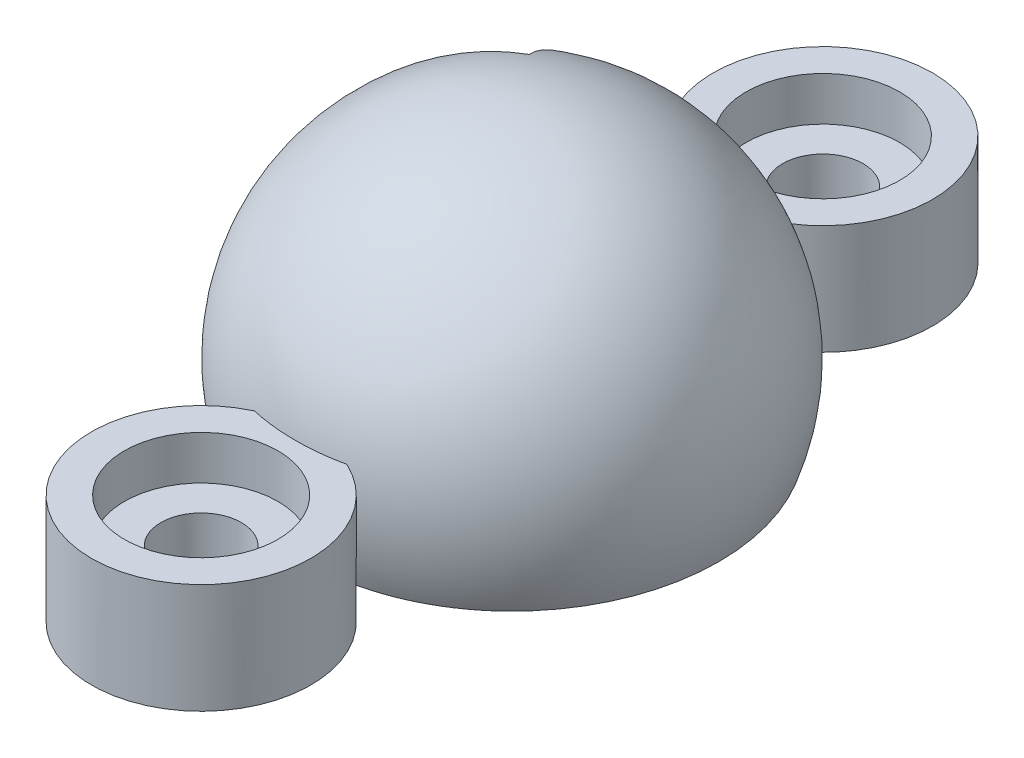
ISO-10303-21;
HEADER;
FILE_DESCRIPTION(('STEP AP214'),'2;1');
FILE_NAME('part.step','',(''),(''),'','','');
FILE_SCHEMA(('AUTOMOTIVE_DESIGN { 1 0 10303 214 1 1 1 1 }'));
ENDSEC;
DATA;
#1=APPLICATION_CONTEXT('core data for automotive mechanical design processes');
#2=APPLICATION_PROTOCOL_DEFINITION('international standard','automotive_design',2000,#1);
#3=PRODUCT_CONTEXT('',#1,'mechanical');
#4=PRODUCT('Part','Part','',(#3));
#5=PRODUCT_RELATED_PRODUCT_CATEGORY('part','',(#4));
#6=PRODUCT_DEFINITION_FORMATION('','',#4);
#7=PRODUCT_DEFINITION_CONTEXT('part definition',#1,'design');
#8=PRODUCT_DEFINITION('design','',#6,#7);
#9=PRODUCT_DEFINITION_SHAPE('','',#8);
#10=(LENGTH_UNIT() NAMED_UNIT(*) SI_UNIT(.MILLI.,.METRE.));
#11=(NAMED_UNIT(*) PLANE_ANGLE_UNIT() SI_UNIT($,.RADIAN.));
#12=(NAMED_UNIT(*) SI_UNIT($,.STERADIAN.) SOLID_ANGLE_UNIT());
#13=UNCERTAINTY_MEASURE_WITH_UNIT(LENGTH_MEASURE(1.E-05),#10,'distance_accuracy_value','');
#14=(GEOMETRIC_REPRESENTATION_CONTEXT(3) GLOBAL_UNCERTAINTY_ASSIGNED_CONTEXT((#13)) GLOBAL_UNIT_ASSIGNED_CONTEXT((#10,
#11,#12)) REPRESENTATION_CONTEXT('',''));
#15=CARTESIAN_POINT('',(0.,0.,0.));
#16=DIRECTION('',(0.,0.,1.));
#17=DIRECTION('',(1.,0.,0.));
#18=AXIS2_PLACEMENT_3D('',#15,#16,#17);
#19=CARTESIAN_POINT('',(-26.2916512459885,73.,0.));
#20=DIRECTION('',(0.,0.,-1.));
#21=DIRECTION('',(-1.,0.,0.));
#22=AXIS2_PLACEMENT_3D('',#19,#20,#21);
#23=SPHERICAL_SURFACE('',#22,6.);
#24=CARTESIAN_POINT('',(-26.2916512459885,71.,0.));
#25=DIRECTION('',(0.,1.,0.));
#26=DIRECTION('',(0.,0.,1.));
#27=AXIS2_PLACEMENT_3D('',#24,#25,#26);
#28=CIRCLE('',#27,5.65685424949238);
#29=CARTESIAN_POINT('',(-25.5125170001679,71.,-5.60294117647059));
#30=VERTEX_POINT('',#29);
#31=CARTESIAN_POINT('',(-25.5125170001679,71.,5.60294117647059));
#32=VERTEX_POINT('',#31);
#33=EDGE_CURVE('E237',#30,#32,#28,.F.);
#34=ORIENTED_EDGE('',*,*,#33,.F.);
#35=CARTESIAN_POINT('',(-25.0274235715006,74.0002,-5.77938823294117));
#36=CARTESIAN_POINT('',(-25.0146304701598,73.9496620404665,-5.78533603706417));
#37=CARTESIAN_POINT('',(-25.0029531709847,73.8988041487702,-5.79086867899217));
#38=CARTESIAN_POINT('',(-24.9817327864956,73.7965686087353,-5.80106400383362));
#39=CARTESIAN_POINT('',(-24.9721892752478,73.7451910662703,-5.80572686033751));
#40=CARTESIAN_POINT('',(-24.946616151379,73.5904873630535,-5.81834985115131));
#41=CARTESIAN_POINT('',(-24.9336295933221,73.4865322631475,-5.82495127439358));
#42=CARTESIAN_POINT('',(-24.9151192768648,73.2757451332539,-5.83442924526646));
#43=CARTESIAN_POINT('',(-24.9097475865905,73.1688967733631,-5.83722984539448));
#44=CARTESIAN_POINT('',(-24.906747367934,72.9550449188531,-5.83878893274145));
#45=CARTESIAN_POINT('',(-24.909119903745,72.8480414049326,-5.83754686442657));
#46=CARTESIAN_POINT('',(-24.921686188706,72.6348501805666,-5.83105898688946));
#47=CARTESIAN_POINT('',(-24.9318625776913,72.52866118703,-5.82582206460827));
#48=CARTESIAN_POINT('',(-24.9603982167538,72.3176550384306,-5.81150186953819));
#49=CARTESIAN_POINT('',(-24.9787560095538,72.2128376424789,-5.80241928175627));
#50=CARTESIAN_POINT('',(-25.0241337429453,72.0065978326292,-5.78080399137251));
#51=CARTESIAN_POINT('',(-25.0510602930963,71.9051512731432,-5.76830868290863));
#52=CARTESIAN_POINT('',(-25.114676095723,71.7058549967528,-5.74030040521022));
#53=CARTESIAN_POINT('',(-25.151356713894,71.6080021854262,-5.72479010809538));
#54=CARTESIAN_POINT('',(-25.2347123432382,71.4206435124871,-5.69200590870795));
#55=CARTESIAN_POINT('',(-25.2810298453866,71.3309707282417,-5.6748043528184));
#56=CARTESIAN_POINT('',(-25.3600341802726,71.2020077467897,-5.64818243977232));
#57=CARTESIAN_POINT('',(-25.3880841969479,71.1597920463394,-5.63913526501787));
#58=CARTESIAN_POINT('',(-25.4476900168088,71.0778030739369,-5.62099148786998));
#59=CARTESIAN_POINT('',(-25.4792525882942,71.0380347549416,-5.61189482333462));
#60=CARTESIAN_POINT('',(-25.5126920090523,70.9997999999984,-5.60289411529386));
#61=B_SPLINE_CURVE_WITH_KNOTS('',3,(#35,#36,#37,#38,#39,#40,#41,#42,#43,#44,#45,#46,#47,#48,#49,
#50,#51,#52,#53,#54,#55,#56,#57,#58,#59,#60),.UNSPECIFIED.,.F.,.F.,(4,2,2,2,2,2,2,2,2,2,2,2,4),
(0.,0.157377048485897,0.314722654217878,0.629234458382304,0.949942579700638,1.27069477382298,
1.59073549691188,1.91071923689571,2.2273285093036,2.54365844666375,2.84986255835421,
3.00416307873593,3.15876624238536),.UNSPECIFIED.);
#62=CARTESIAN_POINT('',(-25.0273729324914,74.,-5.77941176470588));
#63=VERTEX_POINT('',#62);
#64=EDGE_CURVE('E221',#63,#30,#61,.T.);
#65=ORIENTED_EDGE('',*,*,#64,.F.);
#66=CARTESIAN_POINT('',(-26.2916512459885,74.,0.));
#67=DIRECTION('',(0.,-1.,0.));
#68=DIRECTION('',(0.,0.,-1.));
#69=AXIS2_PLACEMENT_3D('',#66,#67,#68);
#70=CIRCLE('',#69,5.91607978309961);
#71=CARTESIAN_POINT('',(-27.5559295594857,74.,-5.77941176470588));
#72=VERTEX_POINT('',#71);
#73=EDGE_CURVE('E245',#63,#72,#70,.F.);
#74=ORIENTED_EDGE('',*,*,#73,.T.);
#75=CARTESIAN_POINT('',(-27.0706104829211,70.9998,-5.60289411529412));
#76=CARTESIAN_POINT('',(-27.0951724269763,71.0278724460279,-5.60950105457931));
#77=CARTESIAN_POINT('',(-27.1187225439086,71.0567865660779,-5.61616491159099));
#78=CARTESIAN_POINT('',(-27.1638983261125,71.1160434934821,-5.62950480182121));
#79=CARTESIAN_POINT('',(-27.1855255224353,71.1463851342512,-5.63618082095439));
#80=CARTESIAN_POINT('',(-27.2475634257149,71.238994388675,-5.65603840498483));
#81=CARTESIAN_POINT('',(-27.2853231738568,71.303072510316,-5.66910337854202));
#82=CARTESIAN_POINT('',(-27.354178857196,71.4339893832936,-5.69422706830234));
#83=CARTESIAN_POINT('',(-27.3853381469219,71.5007937830541,-5.70629460260237));
#84=CARTESIAN_POINT('',(-27.4421869976495,71.6369688871939,-5.72922297039156));
#85=CARTESIAN_POINT('',(-27.4678697942072,71.7063426425279,-5.74008230371415));
#86=CARTESIAN_POINT('',(-27.5214490106654,71.8687142272823,-5.76345066197582));
#87=CARTESIAN_POINT('',(-27.5475676426472,71.9623745047603,-5.77542903147855));
#88=CARTESIAN_POINT('',(-27.5921985299443,72.1518627703867,-5.79645035012798));
#89=CARTESIAN_POINT('',(-27.6107044281248,72.2476925000107,-5.80549084463764));
#90=CARTESIAN_POINT('',(-27.6407970894118,72.4413341169983,-5.82043119119931));
#91=CARTESIAN_POINT('',(-27.6523360470602,72.5391550423461,-5.82630931453206));
#92=CARTESIAN_POINT('',(-27.6686687355714,72.7354433347071,-5.83468458220686));
#93=CARTESIAN_POINT('',(-27.6734661104114,72.8339103235676,-5.83718355302931));
#94=CARTESIAN_POINT('',(-27.6763569232488,73.0229211548644,-5.83868607168889));
#95=CARTESIAN_POINT('',(-27.6749657083667,73.1134555342483,-5.83795833659046));
#96=CARTESIAN_POINT('',(-27.666592837381,73.2941775183516,-5.83362505478977));
#97=CARTESIAN_POINT('',(-27.6596125057349,73.3843652001411,-5.83002018988385));
#98=CARTESIAN_POINT('',(-27.6399974977805,73.5629332316181,-5.82005707797701));
#99=CARTESIAN_POINT('',(-27.6274283782101,73.6513224558663,-5.81373078071612));
#100=CARTESIAN_POINT('',(-27.5962677850448,73.8268475917443,-5.79847549481539));
#101=CARTESIAN_POINT('',(-27.5776732149121,73.9139828348421,-5.78954516817626));
#102=CARTESIAN_POINT('',(-27.5558789204764,74.0002,-5.77938823294117));
#103=B_SPLINE_CURVE_WITH_KNOTS('',3,(#75,#76,#77,#78,#79,#80,#81,#82,#83,#84,#85,#86,#87,#88,
#89,#90,#91,#92,#93,#94,#95,#96,#97,#98,#99,#100,#101,#102),.UNSPECIFIED.,.F.,.F.,(4,2,2,2,2,2,
2,2,2,2,2,2,2,4),(0.,0.113585797209034,0.227080330731854,0.453169231822953,0.676978393535298,
0.901062418299851,1.19454534747401,1.48827285917147,1.78399360635949,2.07955444826479,
2.35098507155556,2.62235139274868,2.89061526718664,3.15901722427241),.UNSPECIFIED.);
#104=CARTESIAN_POINT('',(-27.0707854918091,71.,-5.60294117647059));
#105=VERTEX_POINT('',#104);
#106=EDGE_CURVE('E233',#105,#72,#103,.T.);
#107=ORIENTED_EDGE('',*,*,#106,.F.);
#108=CARTESIAN_POINT('',(-27.0707854918091,71.,5.60294117647059));
#109=VERTEX_POINT('',#108);
#110=EDGE_CURVE('E238',#109,#105,#28,.F.);
#111=ORIENTED_EDGE('',*,*,#110,.F.);
#112=CARTESIAN_POINT('',(-27.5558789204764,74.0002,5.77938823294117));
#113=CARTESIAN_POINT('',(-27.5686720218173,73.9496620404665,5.78533603706417));
#114=CARTESIAN_POINT('',(-27.5803493209923,73.8988041487702,5.79086867899217));
#115=CARTESIAN_POINT('',(-27.6015697054814,73.7965686087353,5.80106400383362));
#116=CARTESIAN_POINT('',(-27.6111132167292,73.7451910662703,5.80572686033751));
#117=CARTESIAN_POINT('',(-27.6366863405981,73.5904873630535,5.81834985115131));
#118=CARTESIAN_POINT('',(-27.6496728986549,73.4865322631475,5.82495127439358));
#119=CARTESIAN_POINT('',(-27.6681832151123,73.2757451332539,5.83442924526646));
#120=CARTESIAN_POINT('',(-27.6735549053866,73.1688967733631,5.83722984539448));
#121=CARTESIAN_POINT('',(-27.676555124043,72.9550449188531,5.83878893274145));
#122=CARTESIAN_POINT('',(-27.674182588232,72.8480414049326,5.83754686442657));
#123=CARTESIAN_POINT('',(-27.661616303271,72.6348501805666,5.83105898688946));
#124=CARTESIAN_POINT('',(-27.6514399142857,72.52866118703,5.82582206460827));
#125=CARTESIAN_POINT('',(-27.6229042752232,72.3176550384306,5.81150186953819));
#126=CARTESIAN_POINT('',(-27.6045464824233,72.2128376424789,5.80241928175627));
#127=CARTESIAN_POINT('',(-27.5591687490317,72.0065978326292,5.78080399137251));
#128=CARTESIAN_POINT('',(-27.5322421988807,71.9051512731432,5.76830868290863));
#129=CARTESIAN_POINT('',(-27.468626396254,71.7058549967528,5.74030040521022));
#130=CARTESIAN_POINT('',(-27.4319457780831,71.6080021854262,5.72479010809538));
#131=CARTESIAN_POINT('',(-27.3485901487389,71.4206435124871,5.69200590870795));
#132=CARTESIAN_POINT('',(-27.3022726465904,71.3309707282417,5.6748043528184));
#133=CARTESIAN_POINT('',(-27.2232683117044,71.2020077467897,5.64818243977232));
#134=CARTESIAN_POINT('',(-27.1952182950292,71.1597920463394,5.63913526501787));
#135=CARTESIAN_POINT('',(-27.1356124751682,71.0778030739369,5.62099148786998));
#136=CARTESIAN_POINT('',(-27.1040499036828,71.0380347549416,5.61189482333462));
#137=CARTESIAN_POINT('',(-27.0706104829247,70.9997999999984,5.60289411529386));
#138=B_SPLINE_CURVE_WITH_KNOTS('',3,(#112,#113,#114,#115,#116,#117,#118,#119,#120,#121,#122,
#123,#124,#125,#126,#127,#128,#129,#130,#131,#132,#133,#134,#135,#136,#137),.UNSPECIFIED.,.F.,
.F.,(4,2,2,2,2,2,2,2,2,2,2,2,4),(0.,0.157377048485897,0.314722654217878,0.629234458382304,
0.949942579700638,1.27069477382298,1.59073549691188,1.91071923689571,2.2273285093036,
2.54365844666375,2.84986255835421,3.00416307873593,3.15876624238536),.UNSPECIFIED.);
#139=CARTESIAN_POINT('',(-27.5559295594857,74.,5.77941176470588));
#140=VERTEX_POINT('',#139);
#141=EDGE_CURVE('E190',#140,#109,#138,.T.);
#142=ORIENTED_EDGE('',*,*,#141,.F.);
#143=CARTESIAN_POINT('',(-26.2916512459885,74.,0.));
#144=DIRECTION('',(0.,-1.,0.));
#145=DIRECTION('',(0.,0.,-1.));
#146=AXIS2_PLACEMENT_3D('',#143,#144,#145);
#147=CIRCLE('',#146,5.91607978309961);
#148=CARTESIAN_POINT('',(-25.0273729324914,74.,5.77941176470588));
#149=VERTEX_POINT('',#148);
#150=EDGE_CURVE('E244',#140,#149,#147,.F.);
#151=ORIENTED_EDGE('',*,*,#150,.T.);
#152=CARTESIAN_POINT('',(-25.512692009056,70.9998,5.60289411529412));
#153=CARTESIAN_POINT('',(-25.4881300650007,71.0278724460279,5.60950105457931));
#154=CARTESIAN_POINT('',(-25.4645799480684,71.0567865660779,5.61616491159099));
#155=CARTESIAN_POINT('',(-25.4194041658645,71.1160434934821,5.62950480182121));
#156=CARTESIAN_POINT('',(-25.3977769695417,71.1463851342512,5.63618082095439));
#157=CARTESIAN_POINT('',(-25.3357390662621,71.238994388675,5.65603840498483));
#158=CARTESIAN_POINT('',(-25.2979793181203,71.303072510316,5.66910337854202));
#159=CARTESIAN_POINT('',(-25.229123634781,71.4339893832936,5.69422706830234));
#160=CARTESIAN_POINT('',(-25.1979643450552,71.5007937830541,5.70629460260237));
#161=CARTESIAN_POINT('',(-25.1411154943275,71.6369688871939,5.72922297039156));
#162=CARTESIAN_POINT('',(-25.1154326977698,71.7063426425279,5.74008230371415));
#163=CARTESIAN_POINT('',(-25.0618534813116,71.8687142272823,5.76345066197582));
#164=CARTESIAN_POINT('',(-25.0357348493299,71.9623745047603,5.77542903147855));
#165=CARTESIAN_POINT('',(-24.9911039620327,72.1518627703867,5.79645035012798));
#166=CARTESIAN_POINT('',(-24.9725980638522,72.2476925000107,5.80549084463764));
#167=CARTESIAN_POINT('',(-24.9425054025653,72.4413341169983,5.82043119119931));
#168=CARTESIAN_POINT('',(-24.9309664449169,72.5391550423461,5.82630931453206));
#169=CARTESIAN_POINT('',(-24.9146337564057,72.7354433347071,5.83468458220686));
#170=CARTESIAN_POINT('',(-24.9098363815657,72.8339103235676,5.83718355302931));
#171=CARTESIAN_POINT('',(-24.9069455687282,73.0229211548644,5.83868607168889));
#172=CARTESIAN_POINT('',(-24.9083367836104,73.1134555342483,5.83795833659046));
#173=CARTESIAN_POINT('',(-24.916709654596,73.2941775183516,5.83362505478977));
#174=CARTESIAN_POINT('',(-24.9236899862422,73.3843652001411,5.83002018988385));
#175=CARTESIAN_POINT('',(-24.9433049941966,73.5629332316181,5.82005707797701));
#176=CARTESIAN_POINT('',(-24.955874113767,73.6513224558663,5.81373078071612));
#177=CARTESIAN_POINT('',(-24.9870347069322,73.8268475917443,5.79847549481539));
#178=CARTESIAN_POINT('',(-25.0056292770649,73.9139828348421,5.78954516817626));
#179=CARTESIAN_POINT('',(-25.0274235715006,74.0002,5.77938823294117));
#180=B_SPLINE_CURVE_WITH_KNOTS('',3,(#152,#153,#154,#155,#156,#157,#158,#159,#160,#161,#162,
#163,#164,#165,#166,#167,#168,#169,#170,#171,#172,#173,#174,#175,#176,#177,#178,#179),
.UNSPECIFIED.,.F.,.F.,(4,2,2,2,2,2,2,2,2,2,2,2,2,4),(0.,0.113585797209034,0.227080330731854,
0.453169231822953,0.676978393535298,0.901062418299851,1.19454534747401,1.48827285917147,
1.78399360635949,2.07955444826479,2.35098507155556,2.62235139274868,2.89061526718664,
3.15901722427241),.UNSPECIFIED.);
#181=EDGE_CURVE('E200',#32,#149,#180,.T.);
#182=ORIENTED_EDGE('',*,*,#181,.F.);
#183=EDGE_LOOP('',(#34,#65,#74,#107,#111,#142,#151,#182));
#184=FACE_BOUND('',#183,.T.);
#185=CARTESIAN_POINT('',(-26.5685991890742,71.7684504931306,-1.42006536784419));
#186=DIRECTION('',(-0.145762075308234,-0.648183950983876,-0.747402825181153));
#187=DIRECTION('',(0.,0.755471507146539,-0.655181503012514));
#188=AXIS2_PLACEMENT_3D('',#185,#186,#187);
#189=CIRCLE('',#188,5.69122131005288);
#190=CARTESIAN_POINT('',(-28.3091391382539,76.0254293010476,-4.77247526435969));
#191=VERTEX_POINT('',#190);
#192=CARTESIAN_POINT('',(-32.1881264123781,72.5784404179814,-1.02658079611846));
#193=VERTEX_POINT('',#192);
#194=EDGE_CURVE('E161',#191,#193,#189,.F.);
#195=ORIENTED_EDGE('',*,*,#194,.F.);
#196=CARTESIAN_POINT('',(-24.3521576089264,74.7234944415331,-1.87294723412062));
#197=DIRECTION('',(0.606091761581906,0.538592012979099,-0.585296010662693));
#198=DIRECTION('',(0.694658370458998,0.,0.71933980033865));
#199=AXIS2_PLACEMENT_3D('',#196,#197,#198);
#200=CIRCLE('',#199,5.07543101617981);
#201=CARTESIAN_POINT('',(-27.7552432520826,78.4885283147863,-1.9323445286713));
#202=VERTEX_POINT('',#201);
#203=EDGE_CURVE('E11',#202,#191,#200,.F.);
#204=ORIENTED_EDGE('',*,*,#203,.F.);
#205=CARTESIAN_POINT('',(-26.0147033029029,74.2315495068694,1.4200653678442));
#206=DIRECTION('',(0.145762075308233,0.648183950983876,0.747402825181153));
#207=DIRECTION('',(0.,-0.755471507146539,0.655181503012514));
#208=AXIS2_PLACEMENT_3D('',#205,#206,#207);
#209=CIRCLE('',#208,5.69122131005288);
#210=CARTESIAN_POINT('',(-31.6342305262068,75.0415394317201,1.81354993956992));
#211=VERTEX_POINT('',#210);
#212=EDGE_CURVE('E156',#211,#202,#209,.F.);
#213=ORIENTED_EDGE('',*,*,#212,.F.);
#214=CARTESIAN_POINT('',(-28.2311448830506,71.2765055584669,1.87294723412062));
#215=DIRECTION('',(-0.606091761581906,-0.538592012979099,0.585296010662693));
#216=DIRECTION('',(-0.694658370458998,0.,-0.71933980033865));
#217=AXIS2_PLACEMENT_3D('',#214,#215,#216);
#218=CIRCLE('',#217,5.07543101617981);
#219=EDGE_CURVE('E164',#193,#211,#218,.F.);
#220=ORIENTED_EDGE('',*,*,#219,.F.);
#221=EDGE_LOOP('',(#195,#204,#213,#220));
#222=FACE_BOUND('',#221,.T.);
#223=ADVANCED_FACE('F41',(#184,#222),#23,.T.);
#224=CARTESIAN_POINT('',(-33.2916512459885,71.,7.));
#225=DIRECTION('',(0.,-1.,0.));
#226=DIRECTION('',(0.,0.,1.));
#227=AXIS2_PLACEMENT_3D('',#224,#225,#226);
#228=PLANE('',#227);
#229=CARTESIAN_POINT('',(-26.2916512459885,71.,8.5));
#230=DIRECTION('',(0.,1.,0.));
#231=DIRECTION('',(0.,0.,1.));
#232=AXIS2_PLACEMENT_3D('',#229,#230,#231);
#233=CIRCLE('',#232,1.1);
#234=CARTESIAN_POINT('',(-26.2916512459885,71.,9.6));
#235=VERTEX_POINT('',#234);
#236=EDGE_CURVE('E175',#235,#235,#233,.F.);
#237=ORIENTED_EDGE('',*,*,#236,.F.);
#238=EDGE_LOOP('',(#237));
#239=FACE_BOUND('',#238,.T.);
#240=CARTESIAN_POINT('',(-26.2916512459885,71.,-8.5));
#241=DIRECTION('',(0.,1.,0.));
#242=DIRECTION('',(0.,0.,1.));
#243=AXIS2_PLACEMENT_3D('',#240,#241,#242);
#244=CIRCLE('',#243,1.1);
#245=CARTESIAN_POINT('',(-26.2916512459885,71.,-7.4));
#246=VERTEX_POINT('',#245);
#247=EDGE_CURVE('E179',#246,#246,#244,.F.);
#248=ORIENTED_EDGE('',*,*,#247,.F.);
#249=EDGE_LOOP('',(#248));
#250=FACE_BOUND('',#249,.T.);
#251=ORIENTED_EDGE('',*,*,#110,.T.);
#252=CARTESIAN_POINT('',(-26.2916512459885,71.,-8.5));
#253=DIRECTION('',(0.,-1.,0.));
#254=DIRECTION('',(0.,0.,-1.));
#255=AXIS2_PLACEMENT_3D('',#252,#253,#254);
#256=CIRCLE('',#255,3.);
#257=EDGE_CURVE('E299',#105,#30,#256,.T.);
#258=ORIENTED_EDGE('',*,*,#257,.T.);
#259=ORIENTED_EDGE('',*,*,#33,.T.);
#260=CARTESIAN_POINT('',(-26.2916512459885,71.,8.5));
#261=DIRECTION('',(0.,-1.,0.));
#262=DIRECTION('',(0.,0.,-1.));
#263=AXIS2_PLACEMENT_3D('',#260,#261,#262);
#264=CIRCLE('',#263,3.);
#265=EDGE_CURVE('E189',#32,#109,#264,.T.);
#266=ORIENTED_EDGE('',*,*,#265,.T.);
#267=EDGE_LOOP('',(#251,#258,#259,#266));
#268=FACE_BOUND('',#267,.T.);
#269=DIRECTION('',(-0.694658370458998,0.,-0.71933980033865));
#270=VECTOR('',#269,1.);
#271=CARTESIAN_POINT('',(-27.9839854222577,71.,1.87444669359595));
#272=LINE('',#271,#270);
#273=CARTESIAN_POINT('',(-28.2933247996857,71.,1.55411639102008));
#274=VERTEX_POINT('',#273);
#275=CARTESIAN_POINT('',(-29.8953497806659,71.,-0.104829040234692));
#276=VERTEX_POINT('',#275);
#277=EDGE_CURVE('E47',#274,#276,#272,.T.);
#278=ORIENTED_EDGE('',*,*,#277,.F.);
#279=DIRECTION('',(-0.373009193509687,0.,0.927827646471721));
#280=VECTOR('',#279,1.);
#281=CARTESIAN_POINT('',(-30.873527525626,71.,7.97214432246016));
#282=LINE('',#281,#280);
#283=CARTESIAN_POINT('',(-28.2495897548034,71.,1.44532930354986));
#284=VERTEX_POINT('',#283);
#285=EDGE_CURVE('E160',#284,#274,#282,.T.);
#286=ORIENTED_EDGE('',*,*,#285,.F.);
#287=CARTESIAN_POINT('',(-26.2916512459885,71.,0.));
#288=DIRECTION('',(0.,1.,0.));
#289=DIRECTION('',(0.,0.,1.));
#290=AXIS2_PLACEMENT_3D('',#287,#288,#289);
#291=CIRCLE('',#290,2.4336187047276);
#292=CARTESIAN_POINT('',(-28.7017378621309,71.,-0.337612948050584));
#293=VERTEX_POINT('',#292);
#294=EDGE_CURVE('E182',#284,#293,#291,.T.);
#295=ORIENTED_EDGE('',*,*,#294,.T.);
#296=DIRECTION('',(0.981508513902753,0.,-0.191418486924357));
#297=VECTOR('',#296,1.);
#298=CARTESIAN_POINT('',(-34.502054522422,71.,0.793592561701173));
#299=LINE('',#298,#297);
#300=EDGE_CURVE('E163',#276,#293,#299,.T.);
#301=ORIENTED_EDGE('',*,*,#300,.F.);
#302=EDGE_LOOP('',(#278,#286,#295,#301));
#303=FACE_BOUND('',#302,.T.);
#304=ADVANCED_FACE('F222',(#239,#250,#268,#303),#228,.T.);
#305=CARTESIAN_POINT('',(-26.2916512459885,73.,0.));
#306=DIRECTION('',(0.,0.,-1.));
#307=DIRECTION('',(-1.,0.,0.));
#308=AXIS2_PLACEMENT_3D('',#305,#306,#307);
#309=SPHERICAL_SURFACE('',#308,3.15);
#310=CARTESIAN_POINT('',(-26.5685991890742,71.7684504931306,-1.42006536784419));
#311=DIRECTION('',(-0.145762075308234,-0.648183950983876,-0.747402825181153));
#312=DIRECTION('',(0.,0.755471507146539,-0.655181503012514));
#313=AXIS2_PLACEMENT_3D('',#310,#311,#312);
#314=CIRCLE('',#313,2.51246890528022);
#315=CARTESIAN_POINT('',(-25.0458124843531,73.1216461783729,-2.89060339501876));
#316=VERTEX_POINT('',#315);
#317=EDGE_CURVE('E139',#316,#293,#314,.F.);
#318=ORIENTED_EDGE('',*,*,#317,.T.);
#319=ORIENTED_EDGE('',*,*,#294,.F.);
#320=CARTESIAN_POINT('',(-26.2916512459885,73.,0.));
#321=DIRECTION('',(0.781924672807029,-0.538308656109162,0.314352663124665));
#322=DIRECTION('',(0.567054775108053,0.823680084758127,0.));
#323=AXIS2_PLACEMENT_3D('',#320,#321,#322);
#324=CIRCLE('',#323,3.15);
#325=CARTESIAN_POINT('',(-27.5374900076239,72.8783538216271,2.89060339501877));
#326=VERTEX_POINT('',#325);
#327=EDGE_CURVE('E65',#284,#326,#324,.F.);
#328=ORIENTED_EDGE('',*,*,#327,.T.);
#329=CARTESIAN_POINT('',(-26.0147033029029,74.2315495068694,1.4200653678442));
#330=DIRECTION('',(0.145762075308233,0.648183950983876,0.747402825181153));
#331=DIRECTION('',(0.,-0.755471507146539,0.655181503012514));
#332=AXIS2_PLACEMENT_3D('',#329,#330,#331);
#333=CIRCLE('',#332,2.51246890528022);
#334=CARTESIAN_POINT('',(-24.4919165981818,75.5847451921116,-0.0504726593303733));
#335=VERTEX_POINT('',#334);
#336=EDGE_CURVE('E258',#326,#335,#333,.F.);
#337=ORIENTED_EDGE('',*,*,#336,.T.);
#338=EDGE_CURVE('E257',#335,#316,#324,.F.);
#339=ORIENTED_EDGE('',*,*,#338,.T.);
#340=EDGE_LOOP('',(#318,#319,#328,#337,#339));
#341=FACE_BOUND('',#340,.T.);
#342=ADVANCED_FACE('F288',(#341),#309,.F.);
#343=CARTESIAN_POINT('',(-26.2916512459885,74.25,8.5));
#344=DIRECTION('',(0.,-1.,0.));
#345=DIRECTION('',(0.,0.,1.));
#346=AXIS2_PLACEMENT_3D('',#343,#344,#345);
#347=CYLINDRICAL_SURFACE('',#346,1.1);
#348=ORIENTED_EDGE('',*,*,#236,.T.);
#349=EDGE_LOOP('',(#348));
#350=FACE_BOUND('',#349,.T.);
#351=CARTESIAN_POINT('',(-26.2916512459885,72.8,8.5));
#352=DIRECTION('',(0.,-1.,0.));
#353=DIRECTION('',(0.,0.,-1.));
#354=AXIS2_PLACEMENT_3D('',#351,#352,#353);
#355=CIRCLE('',#354,1.1);
#356=CARTESIAN_POINT('',(-26.2916512459885,72.8,7.4));
#357=VERTEX_POINT('',#356);
#358=EDGE_CURVE('E171',#357,#357,#355,.T.);
#359=ORIENTED_EDGE('',*,*,#358,.F.);
#360=EDGE_LOOP('',(#359));
#361=FACE_BOUND('',#360,.T.);
#362=ADVANCED_FACE('F333',(#350,#361),#347,.F.);
#363=CARTESIAN_POINT('',(-26.2916512459885,74.25,-8.5));
#364=DIRECTION('',(0.,-1.,0.));
#365=DIRECTION('',(0.,0.,1.));
#366=AXIS2_PLACEMENT_3D('',#363,#364,#365);
#367=CYLINDRICAL_SURFACE('',#366,1.1);
#368=ORIENTED_EDGE('',*,*,#247,.T.);
#369=EDGE_LOOP('',(#368));
#370=FACE_BOUND('',#369,.T.);
#371=CARTESIAN_POINT('',(-26.2916512459885,72.8,-8.5));
#372=DIRECTION('',(0.,-1.,0.));
#373=DIRECTION('',(0.,0.,-1.));
#374=AXIS2_PLACEMENT_3D('',#371,#372,#373);
#375=CIRCLE('',#374,1.1);
#376=CARTESIAN_POINT('',(-26.2916512459885,72.8,-9.6));
#377=VERTEX_POINT('',#376);
#378=EDGE_CURVE('E177',#377,#377,#375,.T.);
#379=ORIENTED_EDGE('',*,*,#378,.F.);
#380=EDGE_LOOP('',(#379));
#381=FACE_BOUND('',#380,.T.);
#382=ADVANCED_FACE('F217',(#370,#381),#367,.F.);
#383=CARTESIAN_POINT('',(-26.2916512459885,74.,-8.5));
#384=DIRECTION('',(0.,-1.,0.));
#385=DIRECTION('',(0.,0.,1.));
#386=AXIS2_PLACEMENT_3D('',#383,#384,#385);
#387=CYLINDRICAL_SURFACE('',#386,3.);
#388=ORIENTED_EDGE('',*,*,#106,.T.);
#389=CARTESIAN_POINT('',(-26.2916512459885,74.,-8.5));
#390=DIRECTION('',(0.,-1.,0.));
#391=DIRECTION('',(0.,0.,-1.));
#392=AXIS2_PLACEMENT_3D('',#389,#390,#391);
#393=CIRCLE('',#392,3.);
#394=EDGE_CURVE('E305',#72,#63,#393,.T.);
#395=ORIENTED_EDGE('',*,*,#394,.T.);
#396=ORIENTED_EDGE('',*,*,#64,.T.);
#397=ORIENTED_EDGE('',*,*,#257,.F.);
#398=EDGE_LOOP('',(#388,#395,#396,#397));
#399=FACE_BOUND('',#398,.T.);
#400=ADVANCED_FACE('F212',(#399),#387,.T.);
#401=CARTESIAN_POINT('',(-26.2916512459885,74.,-8.5));
#402=DIRECTION('',(0.,1.,0.));
#403=DIRECTION('',(0.,0.,-1.));
#404=AXIS2_PLACEMENT_3D('',#401,#402,#403);
#405=PLANE('',#404);
#406=CARTESIAN_POINT('',(-26.2916512459885,74.,-8.5));
#407=DIRECTION('',(0.,-1.,0.));
#408=DIRECTION('',(0.,0.,-1.));
#409=AXIS2_PLACEMENT_3D('',#406,#407,#408);
#410=CIRCLE('',#409,2.1);
#411=CARTESIAN_POINT('',(-26.2916512459885,74.,-10.6));
#412=VERTEX_POINT('',#411);
#413=EDGE_CURVE('E183',#412,#412,#410,.F.);
#414=ORIENTED_EDGE('',*,*,#413,.F.);
#415=EDGE_LOOP('',(#414));
#416=FACE_BOUND('',#415,.T.);
#417=ORIENTED_EDGE('',*,*,#394,.F.);
#418=ORIENTED_EDGE('',*,*,#73,.F.);
#419=EDGE_LOOP('',(#417,#418));
#420=FACE_BOUND('',#419,.T.);
#421=ADVANCED_FACE('F209',(#416,#420),#405,.T.);
#422=CARTESIAN_POINT('',(-26.2916512459885,74.,8.5));
#423=DIRECTION('',(0.,-1.,0.));
#424=DIRECTION('',(0.,0.,1.));
#425=AXIS2_PLACEMENT_3D('',#422,#423,#424);
#426=CYLINDRICAL_SURFACE('',#425,3.);
#427=ORIENTED_EDGE('',*,*,#181,.T.);
#428=CARTESIAN_POINT('',(-26.2916512459885,74.,8.5));
#429=DIRECTION('',(0.,-1.,0.));
#430=DIRECTION('',(0.,0.,-1.));
#431=AXIS2_PLACEMENT_3D('',#428,#429,#430);
#432=CIRCLE('',#431,3.);
#433=EDGE_CURVE('E184',#149,#140,#432,.T.);
#434=ORIENTED_EDGE('',*,*,#433,.T.);
#435=ORIENTED_EDGE('',*,*,#141,.T.);
#436=ORIENTED_EDGE('',*,*,#265,.F.);
#437=EDGE_LOOP('',(#427,#434,#435,#436));
#438=FACE_BOUND('',#437,.T.);
#439=ADVANCED_FACE('F204',(#438),#426,.T.);
#440=CARTESIAN_POINT('',(-26.2916512459885,74.,8.5));
#441=DIRECTION('',(0.,1.,0.));
#442=DIRECTION('',(0.,0.,-1.));
#443=AXIS2_PLACEMENT_3D('',#440,#441,#442);
#444=PLANE('',#443);
#445=CARTESIAN_POINT('',(-26.2916512459885,74.,8.5));
#446=DIRECTION('',(0.,-1.,0.));
#447=DIRECTION('',(0.,0.,-1.));
#448=AXIS2_PLACEMENT_3D('',#445,#446,#447);
#449=CIRCLE('',#448,2.1);
#450=CARTESIAN_POINT('',(-26.2916512459885,74.,6.4));
#451=VERTEX_POINT('',#450);
#452=EDGE_CURVE('E176',#451,#451,#449,.F.);
#453=ORIENTED_EDGE('',*,*,#452,.F.);
#454=EDGE_LOOP('',(#453));
#455=FACE_BOUND('',#454,.T.);
#456=ORIENTED_EDGE('',*,*,#433,.F.);
#457=ORIENTED_EDGE('',*,*,#150,.F.);
#458=EDGE_LOOP('',(#456,#457));
#459=FACE_BOUND('',#458,.T.);
#460=ADVANCED_FACE('F206',(#455,#459),#444,.T.);
#461=CARTESIAN_POINT('',(-26.2916512459885,74.25,-8.5));
#462=DIRECTION('',(0.,-1.,0.));
#463=DIRECTION('',(0.,0.,1.));
#464=AXIS2_PLACEMENT_3D('',#461,#462,#463);
#465=CYLINDRICAL_SURFACE('',#464,2.1);
#466=ORIENTED_EDGE('',*,*,#413,.T.);
#467=EDGE_LOOP('',(#466));
#468=FACE_BOUND('',#467,.T.);
#469=CARTESIAN_POINT('',(-26.2916512459885,72.8,-8.5));
#470=DIRECTION('',(0.,-1.,0.));
#471=DIRECTION('',(0.,0.,-1.));
#472=AXIS2_PLACEMENT_3D('',#469,#470,#471);
#473=CIRCLE('',#472,2.1);
#474=CARTESIAN_POINT('',(-26.2916512459885,72.8,-10.6));
#475=VERTEX_POINT('',#474);
#476=EDGE_CURVE('E174',#475,#475,#473,.T.);
#477=ORIENTED_EDGE('',*,*,#476,.T.);
#478=EDGE_LOOP('',(#477));
#479=FACE_BOUND('',#478,.T.);
#480=ADVANCED_FACE('F307',(#468,#479),#465,.F.);
#481=CARTESIAN_POINT('',(-26.2916512459885,72.8,-8.5));
#482=DIRECTION('',(0.,1.,0.));
#483=DIRECTION('',(0.,0.,-1.));
#484=AXIS2_PLACEMENT_3D('',#481,#482,#483);
#485=PLANE('',#484);
#486=ORIENTED_EDGE('',*,*,#378,.T.);
#487=EDGE_LOOP('',(#486));
#488=FACE_BOUND('',#487,.T.);
#489=ORIENTED_EDGE('',*,*,#476,.F.);
#490=EDGE_LOOP('',(#489));
#491=FACE_BOUND('',#490,.T.);
#492=ADVANCED_FACE('F313',(#488,#491),#485,.T.);
#493=CARTESIAN_POINT('',(-26.2916512459885,74.25,8.5));
#494=DIRECTION('',(0.,-1.,0.));
#495=DIRECTION('',(0.,0.,1.));
#496=AXIS2_PLACEMENT_3D('',#493,#494,#495);
#497=CYLINDRICAL_SURFACE('',#496,2.1);
#498=ORIENTED_EDGE('',*,*,#452,.T.);
#499=EDGE_LOOP('',(#498));
#500=FACE_BOUND('',#499,.T.);
#501=CARTESIAN_POINT('',(-26.2916512459885,72.8,8.5));
#502=DIRECTION('',(0.,-1.,0.));
#503=DIRECTION('',(0.,0.,-1.));
#504=AXIS2_PLACEMENT_3D('',#501,#502,#503);
#505=CIRCLE('',#504,2.1);
#506=CARTESIAN_POINT('',(-26.2916512459885,72.8,6.4));
#507=VERTEX_POINT('',#506);
#508=EDGE_CURVE('E166',#507,#507,#505,.T.);
#509=ORIENTED_EDGE('',*,*,#508,.T.);
#510=EDGE_LOOP('',(#509));
#511=FACE_BOUND('',#510,.T.);
#512=ADVANCED_FACE('F316',(#500,#511),#497,.F.);
#513=CARTESIAN_POINT('',(-26.2916512459885,72.8,8.5));
#514=DIRECTION('',(0.,1.,0.));
#515=DIRECTION('',(0.,0.,-1.));
#516=AXIS2_PLACEMENT_3D('',#513,#514,#515);
#517=PLANE('',#516);
#518=ORIENTED_EDGE('',*,*,#358,.T.);
#519=EDGE_LOOP('',(#518));
#520=FACE_BOUND('',#519,.T.);
#521=ORIENTED_EDGE('',*,*,#508,.F.);
#522=EDGE_LOOP('',(#521));
#523=FACE_BOUND('',#522,.T.);
#524=ADVANCED_FACE('F321',(#520,#523),#517,.T.);
#525=CARTESIAN_POINT('',(-31.8944563939111,81.3381305094941,-3.59640849752307));
#526=DIRECTION('',(-0.145762075308233,-0.648183950983876,-0.747402825181153));
#527=DIRECTION('',(0.,-0.755471507146539,0.655181503012514));
#528=AXIS2_PLACEMENT_3D('',#525,#526,#527);
#529=PLANE('',#528);
#530=DIRECTION('',(0.781924672807028,-0.538308656109163,0.314352663124665));
#531=VECTOR('',#530,1.);
#532=CARTESIAN_POINT('',(-35.7734436680353,77.8911416264279,0.149485970718159));
#533=LINE('',#532,#531);
#534=CARTESIAN_POINT('',(-27.954196939965,72.5080550653363,3.29301260196481));
#535=VERTEX_POINT('',#534);
#536=EDGE_CURVE('E155',#211,#535,#533,.T.);
#537=ORIENTED_EDGE('',*,*,#536,.F.);
#538=ORIENTED_EDGE('',*,*,#212,.T.);
#539=DIRECTION('',(0.781924672807028,-0.538308656109163,0.314352663124665));
#540=VECTOR('',#539,1.);
#541=CARTESIAN_POINT('',(-31.8944563939111,81.3381305094941,-3.59640849752307));
#542=LINE('',#541,#540);
#543=CARTESIAN_POINT('',(-24.0752096658408,75.9550439484025,-0.452881866276421));
#544=VERTEX_POINT('',#543);
#545=EDGE_CURVE('E54',#202,#544,#542,.T.);
#546=ORIENTED_EDGE('',*,*,#545,.T.);
#547=DIRECTION('',(-0.606091761581907,-0.538592012979101,0.585296010662692));
#548=VECTOR('',#547,1.);
#549=CARTESIAN_POINT('',(-24.0752096658408,75.9550439484025,-0.452881866276421));
#550=LINE('',#549,#548);
#551=EDGE_CURVE('E143',#544,#335,#550,.T.);
#552=ORIENTED_EDGE('',*,*,#551,.T.);
#553=ORIENTED_EDGE('',*,*,#336,.F.);
#554=EDGE_CURVE('E149',#326,#535,#550,.T.);
#555=ORIENTED_EDGE('',*,*,#554,.T.);
#556=EDGE_LOOP('',(#537,#538,#546,#552,#553,#555));
#557=FACE_BOUND('',#556,.T.);
#558=ADVANCED_FACE('F274',(#557),#529,.T.);
#559=CARTESIAN_POINT('',(-46.8018062660292,32.2202615043522,-18.815460044195));
#560=DIRECTION('',(-0.781924672807029,0.538308656109162,-0.314352663124665));
#561=DIRECTION('',(0.567054775108053,0.823680084758127,0.));
#562=AXIS2_PLACEMENT_3D('',#559,#560,#561);
#563=PLANE('',#562);
#564=ORIENTED_EDGE('',*,*,#338,.F.);
#565=ORIENTED_EDGE('',*,*,#551,.F.);
#566=DIRECTION('',(0.145762075308235,0.648183950983877,0.747402825181152));
#567=VECTOR('',#566,1.);
#568=CARTESIAN_POINT('',(-24.6291055520121,73.4919449346637,-3.29301260196481));
#569=LINE('',#568,#567);
#570=CARTESIAN_POINT('',(-24.6291055520121,73.4919449346637,-3.29301260196481));
#571=VERTEX_POINT('',#570);
#572=EDGE_CURVE('E129',#571,#544,#569,.T.);
#573=ORIENTED_EDGE('',*,*,#572,.F.);
#574=DIRECTION('',(0.606091761581906,0.538592012979101,-0.585296010662692));
#575=VECTOR('',#574,1.);
#576=CARTESIAN_POINT('',(-28.5080928261363,70.0449560515975,0.452881866276421));
#577=LINE('',#576,#575);
#578=EDGE_CURVE('E134',#316,#571,#577,.T.);
#579=ORIENTED_EDGE('',*,*,#578,.F.);
#580=EDGE_LOOP('',(#564,#565,#573,#579));
#581=FACE_BOUND('',#580,.T.);
#582=ADVANCED_FACE('F144',(#581),#563,.T.);
#583=CARTESIAN_POINT('',(-35.7734436680353,77.8911416264279,0.149485970718159));
#584=DIRECTION('',(0.606091761581906,0.538592012979099,-0.585296010662693));
#585=DIRECTION('',(-0.694658370458998,0.,-0.71933980033865));
#586=AXIS2_PLACEMENT_3D('',#583,#584,#585);
#587=PLANE('',#586);
#588=DIRECTION('',(0.781924672807028,-0.538308656109163,0.314352663124665));
#589=VECTOR('',#588,1.);
#590=CARTESIAN_POINT('',(-36.3273395542066,75.4280426126891,-2.69064476497023));
#591=LINE('',#590,#589);
#592=EDGE_CURVE('E135',#193,#276,#591,.T.);
#593=ORIENTED_EDGE('',*,*,#592,.F.);
#594=ORIENTED_EDGE('',*,*,#219,.T.);
#595=ORIENTED_EDGE('',*,*,#536,.T.);
#596=DIRECTION('',(-0.145762075308234,-0.648183950983878,-0.747402825181152));
#597=VECTOR('',#596,1.);
#598=CARTESIAN_POINT('',(-27.954196939965,72.5080550653363,3.29301260196481));
#599=LINE('',#598,#597);
#600=EDGE_CURVE('E145',#535,#274,#599,.T.);
#601=ORIENTED_EDGE('',*,*,#600,.T.);
#602=ORIENTED_EDGE('',*,*,#277,.T.);
#603=EDGE_LOOP('',(#593,#594,#595,#601,#602));
#604=FACE_BOUND('',#603,.T.);
#605=ADVANCED_FACE('F267',(#604),#587,.T.);
#606=CARTESIAN_POINT('',(-36.3273395542066,75.4280426126891,-2.69064476497023));
#607=DIRECTION('',(0.145762075308234,0.648183950983876,0.747402825181153));
#608=DIRECTION('',(0.,0.755471507146539,-0.655181503012514));
#609=AXIS2_PLACEMENT_3D('',#606,#607,#608);
#610=PLANE('',#609);
#611=DIRECTION('',(0.781924672807028,-0.538308656109163,0.314352663124665));
#612=VECTOR('',#611,1.);
#613=CARTESIAN_POINT('',(-32.4483522800824,78.8750314957554,-6.43653923321146));
#614=LINE('',#613,#612);
#615=EDGE_CURVE('E125',#191,#571,#614,.T.);
#616=ORIENTED_EDGE('',*,*,#615,.F.);
#617=ORIENTED_EDGE('',*,*,#194,.T.);
#618=ORIENTED_EDGE('',*,*,#592,.T.);
#619=ORIENTED_EDGE('',*,*,#300,.T.);
#620=ORIENTED_EDGE('',*,*,#317,.F.);
#621=ORIENTED_EDGE('',*,*,#578,.T.);
#622=EDGE_LOOP('',(#616,#617,#618,#619,#620,#621));
#623=FACE_BOUND('',#622,.T.);
#624=ADVANCED_FACE('F137',(#623),#610,.T.);
#625=CARTESIAN_POINT('',(-32.4483522800824,78.8750314957554,-6.43653923321146));
#626=DIRECTION('',(-0.606091761581906,-0.538592012979099,0.585296010662693));
#627=DIRECTION('',(0.694658370458998,0.,0.71933980033865));
#628=AXIS2_PLACEMENT_3D('',#625,#626,#627);
#629=PLANE('',#628);
#630=ORIENTED_EDGE('',*,*,#545,.F.);
#631=ORIENTED_EDGE('',*,*,#203,.T.);
#632=ORIENTED_EDGE('',*,*,#615,.T.);
#633=ORIENTED_EDGE('',*,*,#572,.T.);
#634=EDGE_LOOP('',(#630,#631,#632,#633));
#635=FACE_BOUND('',#634,.T.);
#636=ADVANCED_FACE('F121',(#635),#629,.T.);
#637=ORIENTED_EDGE('',*,*,#327,.F.);
#638=ORIENTED_EDGE('',*,*,#285,.T.);
#639=ORIENTED_EDGE('',*,*,#600,.F.);
#640=ORIENTED_EDGE('',*,*,#554,.F.);
#641=EDGE_LOOP('',(#637,#638,#639,#640));
#642=FACE_BOUND('',#641,.T.);
#643=ADVANCED_FACE('F279',(#642),#563,.T.);
#644=CLOSED_SHELL('',(#223,#304,#342,#362,#382,#400,#421,#439,#460,#480,#492,#512,#524,#558,
#582,#605,#624,#636,#643));
#645=MANIFOLD_SOLID_BREP('B2',#644);
#646=ADVANCED_BREP_SHAPE_REPRESENTATION('',(#18,#645),#14);
#647=SHAPE_DEFINITION_REPRESENTATION(#9,#646);
ENDSEC;
END-ISO-10303-21;
